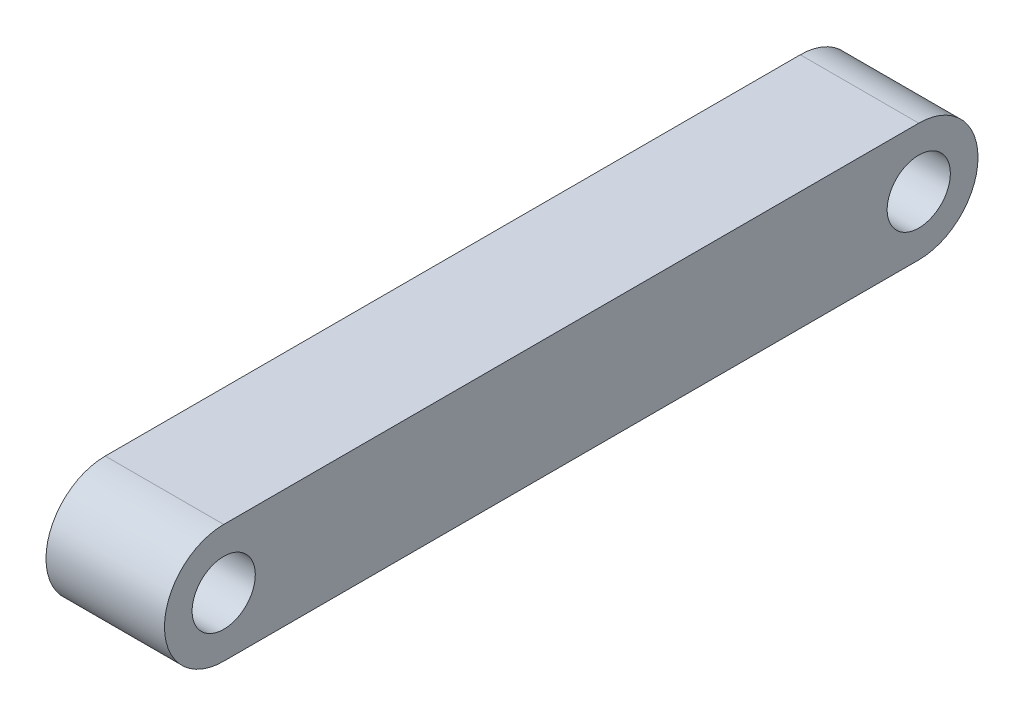
ISO-10303-21;
HEADER;
FILE_DESCRIPTION(('STEP AP214'),'2;1');
FILE_NAME('part.step','',(''),(''),'','','');
FILE_SCHEMA(('AUTOMOTIVE_DESIGN { 1 0 10303 214 1 1 1 1 }'));
ENDSEC;
DATA;
#1=APPLICATION_CONTEXT('core data for automotive mechanical design processes');
#2=APPLICATION_PROTOCOL_DEFINITION('international standard','automotive_design',2000,#1);
#3=PRODUCT_CONTEXT('',#1,'mechanical');
#4=PRODUCT('Part','Part','',(#3));
#5=PRODUCT_RELATED_PRODUCT_CATEGORY('part','',(#4));
#6=PRODUCT_DEFINITION_FORMATION('','',#4);
#7=PRODUCT_DEFINITION_CONTEXT('part definition',#1,'design');
#8=PRODUCT_DEFINITION('design','',#6,#7);
#9=PRODUCT_DEFINITION_SHAPE('','',#8);
#10=(LENGTH_UNIT() NAMED_UNIT(*) SI_UNIT(.MILLI.,.METRE.));
#11=(NAMED_UNIT(*) PLANE_ANGLE_UNIT() SI_UNIT($,.RADIAN.));
#12=(NAMED_UNIT(*) SI_UNIT($,.STERADIAN.) SOLID_ANGLE_UNIT());
#13=UNCERTAINTY_MEASURE_WITH_UNIT(LENGTH_MEASURE(1.E-05),#10,'distance_accuracy_value','');
#14=(GEOMETRIC_REPRESENTATION_CONTEXT(3) GLOBAL_UNCERTAINTY_ASSIGNED_CONTEXT((#13)) GLOBAL_UNIT_ASSIGNED_CONTEXT((#10,
#11,#12)) REPRESENTATION_CONTEXT('',''));
#15=CARTESIAN_POINT('',(0.,0.,0.));
#16=DIRECTION('',(0.,0.,1.));
#17=DIRECTION('',(1.,0.,0.));
#18=AXIS2_PLACEMENT_3D('',#15,#16,#17);
#19=CARTESIAN_POINT('',(7.5,0.,44.));
#20=DIRECTION('',(1.,0.,0.));
#21=DIRECTION('',(0.,0.,-1.));
#22=AXIS2_PLACEMENT_3D('',#19,#20,#21);
#23=PLANE('',#22);
#24=CARTESIAN_POINT('',(7.5,0.,44.));
#25=DIRECTION('',(1.,0.,0.));
#26=DIRECTION('',(0.,0.,-1.));
#27=AXIS2_PLACEMENT_3D('',#24,#25,#26);
#28=CIRCLE('',#27,4.);
#29=CARTESIAN_POINT('',(7.5,0.,40.));
#30=VERTEX_POINT('',#29);
#31=EDGE_CURVE('E101',#30,#30,#28,.T.);
#32=ORIENTED_EDGE('',*,*,#31,.F.);
#33=EDGE_LOOP('',(#32));
#34=FACE_BOUND('',#33,.T.);
#35=CARTESIAN_POINT('',(7.5,0.,44.));
#36=DIRECTION('',(1.,0.,0.));
#37=DIRECTION('',(0.,0.,-1.));
#38=AXIS2_PLACEMENT_3D('',#35,#36,#37);
#39=CIRCLE('',#38,7.5);
#40=CARTESIAN_POINT('',(7.5,7.5,44.));
#41=VERTEX_POINT('',#40);
#42=CARTESIAN_POINT('',(7.5,-7.5,44.));
#43=VERTEX_POINT('',#42);
#44=EDGE_CURVE('E86',#41,#43,#39,.T.);
#45=ORIENTED_EDGE('',*,*,#44,.T.);
#46=DIRECTION('',(0.,0.,-1.));
#47=VECTOR('',#46,1.);
#48=CARTESIAN_POINT('',(7.5,-7.5,44.));
#49=LINE('',#48,#47);
#50=CARTESIAN_POINT('',(7.5,-7.49999999999998,-44.));
#51=VERTEX_POINT('',#50);
#52=EDGE_CURVE('E81',#43,#51,#49,.T.);
#53=ORIENTED_EDGE('',*,*,#52,.T.);
#54=CARTESIAN_POINT('',(7.5,0.,-44.));
#55=DIRECTION('',(1.,0.,0.));
#56=DIRECTION('',(0.,0.,-1.));
#57=AXIS2_PLACEMENT_3D('',#54,#55,#56);
#58=CIRCLE('',#57,7.5);
#59=CARTESIAN_POINT('',(7.5,7.50000000000002,-44.));
#60=VERTEX_POINT('',#59);
#61=EDGE_CURVE('E84',#51,#60,#58,.T.);
#62=ORIENTED_EDGE('',*,*,#61,.T.);
#63=DIRECTION('',(0.,0.,1.));
#64=VECTOR('',#63,1.);
#65=CARTESIAN_POINT('',(7.5,7.5,44.));
#66=LINE('',#65,#64);
#67=EDGE_CURVE('E51',#60,#41,#66,.T.);
#68=ORIENTED_EDGE('',*,*,#67,.T.);
#69=EDGE_LOOP('',(#45,#53,#62,#68));
#70=FACE_BOUND('',#69,.T.);
#71=CARTESIAN_POINT('',(7.5,0.,-44.));
#72=DIRECTION('',(1.,0.,0.));
#73=DIRECTION('',(0.,0.,-1.));
#74=AXIS2_PLACEMENT_3D('',#71,#72,#73);
#75=CIRCLE('',#74,4.00000000000001);
#76=CARTESIAN_POINT('',(7.5,0.,-48.));
#77=VERTEX_POINT('',#76);
#78=EDGE_CURVE('E116',#77,#77,#75,.T.);
#79=ORIENTED_EDGE('',*,*,#78,.F.);
#80=EDGE_LOOP('',(#79));
#81=FACE_BOUND('',#80,.T.);
#82=ADVANCED_FACE('F34',(#34,#70,#81),#23,.T.);
#83=CARTESIAN_POINT('',(-7.5,0.,44.));
#84=DIRECTION('',(1.,0.,0.));
#85=DIRECTION('',(0.,0.,-1.));
#86=AXIS2_PLACEMENT_3D('',#83,#84,#85);
#87=PLANE('',#86);
#88=CARTESIAN_POINT('',(-7.5,0.,44.));
#89=DIRECTION('',(1.,0.,0.));
#90=DIRECTION('',(0.,0.,-1.));
#91=AXIS2_PLACEMENT_3D('',#88,#89,#90);
#92=CIRCLE('',#91,7.5);
#93=CARTESIAN_POINT('',(-7.5,7.5,44.));
#94=VERTEX_POINT('',#93);
#95=CARTESIAN_POINT('',(-7.5,-7.5,44.));
#96=VERTEX_POINT('',#95);
#97=EDGE_CURVE('E98',#94,#96,#92,.T.);
#98=ORIENTED_EDGE('',*,*,#97,.F.);
#99=DIRECTION('',(0.,0.,1.));
#100=VECTOR('',#99,1.);
#101=CARTESIAN_POINT('',(-7.5,7.5,44.));
#102=LINE('',#101,#100);
#103=CARTESIAN_POINT('',(-7.5,7.50000000000002,-44.));
#104=VERTEX_POINT('',#103);
#105=EDGE_CURVE('E74',#104,#94,#102,.T.);
#106=ORIENTED_EDGE('',*,*,#105,.F.);
#107=CARTESIAN_POINT('',(-7.5,0.,-44.));
#108=DIRECTION('',(1.,0.,0.));
#109=DIRECTION('',(0.,0.,-1.));
#110=AXIS2_PLACEMENT_3D('',#107,#108,#109);
#111=CIRCLE('',#110,7.5);
#112=CARTESIAN_POINT('',(-7.5,-7.49999999999998,-44.));
#113=VERTEX_POINT('',#112);
#114=EDGE_CURVE('E68',#113,#104,#111,.T.);
#115=ORIENTED_EDGE('',*,*,#114,.F.);
#116=DIRECTION('',(0.,0.,-1.));
#117=VECTOR('',#116,1.);
#118=CARTESIAN_POINT('',(-7.5,-7.5,44.));
#119=LINE('',#118,#117);
#120=EDGE_CURVE('E90',#96,#113,#119,.T.);
#121=ORIENTED_EDGE('',*,*,#120,.F.);
#122=EDGE_LOOP('',(#98,#106,#115,#121));
#123=FACE_BOUND('',#122,.T.);
#124=CARTESIAN_POINT('',(-7.5,0.,44.));
#125=DIRECTION('',(1.,0.,0.));
#126=DIRECTION('',(0.,0.,-1.));
#127=AXIS2_PLACEMENT_3D('',#124,#125,#126);
#128=CIRCLE('',#127,4.);
#129=CARTESIAN_POINT('',(-7.5,0.,40.));
#130=VERTEX_POINT('',#129);
#131=EDGE_CURVE('E113',#130,#130,#128,.T.);
#132=ORIENTED_EDGE('',*,*,#131,.T.);
#133=EDGE_LOOP('',(#132));
#134=FACE_BOUND('',#133,.T.);
#135=CARTESIAN_POINT('',(-7.5,0.,-44.));
#136=DIRECTION('',(1.,0.,0.));
#137=DIRECTION('',(0.,0.,-1.));
#138=AXIS2_PLACEMENT_3D('',#135,#136,#137);
#139=CIRCLE('',#138,4.00000000000001);
#140=CARTESIAN_POINT('',(-7.5,0.,-48.));
#141=VERTEX_POINT('',#140);
#142=EDGE_CURVE('E119',#141,#141,#139,.T.);
#143=ORIENTED_EDGE('',*,*,#142,.T.);
#144=EDGE_LOOP('',(#143));
#145=FACE_BOUND('',#144,.T.);
#146=ADVANCED_FACE('F109',(#123,#134,#145),#87,.F.);
#147=CARTESIAN_POINT('',(7.5,0.,44.));
#148=DIRECTION('',(-1.,0.,0.));
#149=DIRECTION('',(0.,0.,1.));
#150=AXIS2_PLACEMENT_3D('',#147,#148,#149);
#151=CYLINDRICAL_SURFACE('',#150,7.5);
#152=ORIENTED_EDGE('',*,*,#97,.T.);
#153=DIRECTION('',(-1.,0.,0.));
#154=VECTOR('',#153,1.);
#155=CARTESIAN_POINT('',(7.5,-7.5,44.));
#156=LINE('',#155,#154);
#157=EDGE_CURVE('E11',#43,#96,#156,.T.);
#158=ORIENTED_EDGE('',*,*,#157,.F.);
#159=ORIENTED_EDGE('',*,*,#44,.F.);
#160=DIRECTION('',(-1.,0.,0.));
#161=VECTOR('',#160,1.);
#162=CARTESIAN_POINT('',(7.5,7.5,44.));
#163=LINE('',#162,#161);
#164=EDGE_CURVE('E94',#41,#94,#163,.T.);
#165=ORIENTED_EDGE('',*,*,#164,.T.);
#166=EDGE_LOOP('',(#152,#158,#159,#165));
#167=FACE_BOUND('',#166,.T.);
#168=ADVANCED_FACE('F36',(#167),#151,.T.);
#169=CARTESIAN_POINT('',(7.5,-7.5,44.));
#170=DIRECTION('',(0.,1.,0.));
#171=DIRECTION('',(0.,0.,1.));
#172=AXIS2_PLACEMENT_3D('',#169,#170,#171);
#173=PLANE('',#172);
#174=ORIENTED_EDGE('',*,*,#120,.T.);
#175=DIRECTION('',(-1.,0.,0.));
#176=VECTOR('',#175,1.);
#177=CARTESIAN_POINT('',(7.5,-7.49999999999998,-44.));
#178=LINE('',#177,#176);
#179=EDGE_CURVE('E43',#51,#113,#178,.T.);
#180=ORIENTED_EDGE('',*,*,#179,.F.);
#181=ORIENTED_EDGE('',*,*,#52,.F.);
#182=ORIENTED_EDGE('',*,*,#157,.T.);
#183=EDGE_LOOP('',(#174,#180,#181,#182));
#184=FACE_BOUND('',#183,.T.);
#185=ADVANCED_FACE('F89',(#184),#173,.F.);
#186=CARTESIAN_POINT('',(7.5,0.,-44.));
#187=DIRECTION('',(-1.,0.,0.));
#188=DIRECTION('',(0.,0.,1.));
#189=AXIS2_PLACEMENT_3D('',#186,#187,#188);
#190=CYLINDRICAL_SURFACE('',#189,7.5);
#191=ORIENTED_EDGE('',*,*,#114,.T.);
#192=DIRECTION('',(-1.,0.,0.));
#193=VECTOR('',#192,1.);
#194=CARTESIAN_POINT('',(7.5,7.50000000000002,-44.));
#195=LINE('',#194,#193);
#196=EDGE_CURVE('E91',#60,#104,#195,.T.);
#197=ORIENTED_EDGE('',*,*,#196,.F.);
#198=ORIENTED_EDGE('',*,*,#61,.F.);
#199=ORIENTED_EDGE('',*,*,#179,.T.);
#200=EDGE_LOOP('',(#191,#197,#198,#199));
#201=FACE_BOUND('',#200,.T.);
#202=ADVANCED_FACE('F92',(#201),#190,.T.);
#203=CARTESIAN_POINT('',(7.5,7.5,44.));
#204=DIRECTION('',(0.,-1.,0.));
#205=DIRECTION('',(0.,0.,-1.));
#206=AXIS2_PLACEMENT_3D('',#203,#204,#205);
#207=PLANE('',#206);
#208=ORIENTED_EDGE('',*,*,#105,.T.);
#209=ORIENTED_EDGE('',*,*,#164,.F.);
#210=ORIENTED_EDGE('',*,*,#67,.F.);
#211=ORIENTED_EDGE('',*,*,#196,.T.);
#212=EDGE_LOOP('',(#208,#209,#210,#211));
#213=FACE_BOUND('',#212,.T.);
#214=ADVANCED_FACE('F106',(#213),#207,.F.);
#215=CARTESIAN_POINT('',(7.5,0.,44.));
#216=DIRECTION('',(-1.,0.,0.));
#217=DIRECTION('',(0.,0.,1.));
#218=AXIS2_PLACEMENT_3D('',#215,#216,#217);
#219=CYLINDRICAL_SURFACE('',#218,4.);
#220=ORIENTED_EDGE('',*,*,#31,.T.);
#221=EDGE_LOOP('',(#220));
#222=FACE_BOUND('',#221,.T.);
#223=ORIENTED_EDGE('',*,*,#131,.F.);
#224=EDGE_LOOP('',(#223));
#225=FACE_BOUND('',#224,.T.);
#226=ADVANCED_FACE('F136',(#222,#225),#219,.F.);
#227=CARTESIAN_POINT('',(7.5,0.,-44.));
#228=DIRECTION('',(-1.,0.,0.));
#229=DIRECTION('',(0.,0.,1.));
#230=AXIS2_PLACEMENT_3D('',#227,#228,#229);
#231=CYLINDRICAL_SURFACE('',#230,4.00000000000001);
#232=ORIENTED_EDGE('',*,*,#78,.T.);
#233=EDGE_LOOP('',(#232));
#234=FACE_BOUND('',#233,.T.);
#235=ORIENTED_EDGE('',*,*,#142,.F.);
#236=EDGE_LOOP('',(#235));
#237=FACE_BOUND('',#236,.T.);
#238=ADVANCED_FACE('F125',(#234,#237),#231,.F.);
#239=CLOSED_SHELL('',(#82,#146,#168,#185,#202,#214,#226,#238));
#240=MANIFOLD_SOLID_BREP('B2',#239);
#241=ADVANCED_BREP_SHAPE_REPRESENTATION('',(#18,#240),#14);
#242=SHAPE_DEFINITION_REPRESENTATION(#9,#241);
ENDSEC;
END-ISO-10303-21;
